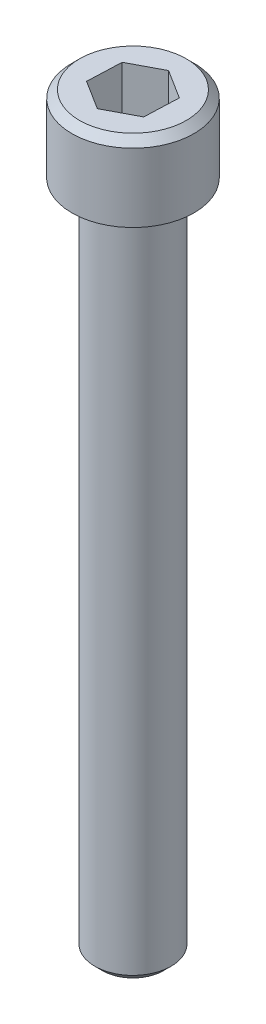
ISO-10303-21;
HEADER;
FILE_DESCRIPTION(('STEP AP214'),'2;1');
FILE_NAME('part.step','',(''),(''),'','','');
FILE_SCHEMA(('AUTOMOTIVE_DESIGN { 1 0 10303 214 1 1 1 1 }'));
ENDSEC;
DATA;
#1=APPLICATION_CONTEXT('core data for automotive mechanical design processes');
#2=APPLICATION_PROTOCOL_DEFINITION('international standard','automotive_design',2000,#1);
#3=PRODUCT_CONTEXT('',#1,'mechanical');
#4=PRODUCT('Part','Part','',(#3));
#5=PRODUCT_RELATED_PRODUCT_CATEGORY('part','',(#4));
#6=PRODUCT_DEFINITION_FORMATION('','',#4);
#7=PRODUCT_DEFINITION_CONTEXT('part definition',#1,'design');
#8=PRODUCT_DEFINITION('design','',#6,#7);
#9=PRODUCT_DEFINITION_SHAPE('','',#8);
#10=(LENGTH_UNIT() NAMED_UNIT(*) SI_UNIT(.MILLI.,.METRE.));
#11=(NAMED_UNIT(*) PLANE_ANGLE_UNIT() SI_UNIT($,.RADIAN.));
#12=(NAMED_UNIT(*) SI_UNIT($,.STERADIAN.) SOLID_ANGLE_UNIT());
#13=UNCERTAINTY_MEASURE_WITH_UNIT(LENGTH_MEASURE(1.E-05),#10,'distance_accuracy_value','');
#14=(GEOMETRIC_REPRESENTATION_CONTEXT(3) GLOBAL_UNCERTAINTY_ASSIGNED_CONTEXT((#13)) GLOBAL_UNIT_ASSIGNED_CONTEXT((#10,
#11,#12)) REPRESENTATION_CONTEXT('',''));
#15=CARTESIAN_POINT('',(0.,0.,0.));
#16=DIRECTION('',(0.,0.,1.));
#17=DIRECTION('',(1.,0.,0.));
#18=AXIS2_PLACEMENT_3D('',#15,#16,#17);
#19=CARTESIAN_POINT('',(0.,98.,0.));
#20=DIRECTION('',(0.,-1.,0.));
#21=DIRECTION('',(0.,0.,-1.));
#22=AXIS2_PLACEMENT_3D('',#19,#20,#21);
#23=CYLINDRICAL_SURFACE('',#22,8.);
#24=CARTESIAN_POINT('',(0.,88.,0.));
#25=DIRECTION('',(0.,1.,0.));
#26=DIRECTION('',(0.,0.,1.));
#27=AXIS2_PLACEMENT_3D('',#24,#25,#26);
#28=CIRCLE('',#27,8.);
#29=CARTESIAN_POINT('',(0.,88.,8.));
#30=VERTEX_POINT('',#29);
#31=EDGE_CURVE('E44',#30,#30,#28,.T.);
#32=ORIENTED_EDGE('',*,*,#31,.T.);
#33=EDGE_LOOP('',(#32));
#34=FACE_BOUND('',#33,.T.);
#35=CARTESIAN_POINT('',(0.,97.,0.));
#36=DIRECTION('',(0.,1.,0.));
#37=DIRECTION('',(0.,0.,1.));
#38=AXIS2_PLACEMENT_3D('',#35,#36,#37);
#39=CIRCLE('',#38,8.);
#40=CARTESIAN_POINT('',(0.,97.,8.));
#41=VERTEX_POINT('',#40);
#42=EDGE_CURVE('E152',#41,#41,#39,.T.);
#43=ORIENTED_EDGE('',*,*,#42,.F.);
#44=EDGE_LOOP('',(#43));
#45=FACE_BOUND('',#44,.T.);
#46=ADVANCED_FACE('F36',(#34,#45),#23,.T.);
#47=CARTESIAN_POINT('',(0.,88.,0.));
#48=DIRECTION('',(0.,-1.,0.));
#49=DIRECTION('',(0.,0.,-1.));
#50=AXIS2_PLACEMENT_3D('',#47,#48,#49);
#51=CYLINDRICAL_SURFACE('',#50,5.);
#52=CARTESIAN_POINT('',(0.,1.,0.));
#53=DIRECTION('',(0.,-1.,0.));
#54=DIRECTION('',(0.,0.,-1.));
#55=AXIS2_PLACEMENT_3D('',#52,#53,#54);
#56=CIRCLE('',#55,5.);
#57=CARTESIAN_POINT('',(0.,1.,-5.));
#58=VERTEX_POINT('',#57);
#59=EDGE_CURVE('E138',#58,#58,#56,.T.);
#60=ORIENTED_EDGE('',*,*,#59,.F.);
#61=EDGE_LOOP('',(#60));
#62=FACE_BOUND('',#61,.T.);
#63=CARTESIAN_POINT('',(0.,88.,0.));
#64=DIRECTION('',(0.,1.,0.));
#65=DIRECTION('',(0.,0.,1.));
#66=AXIS2_PLACEMENT_3D('',#63,#64,#65);
#67=CIRCLE('',#66,5.);
#68=CARTESIAN_POINT('',(0.,88.,5.));
#69=VERTEX_POINT('',#68);
#70=EDGE_CURVE('E11',#69,#69,#67,.T.);
#71=ORIENTED_EDGE('',*,*,#70,.F.);
#72=EDGE_LOOP('',(#71));
#73=FACE_BOUND('',#72,.T.);
#74=ADVANCED_FACE('F38',(#62,#73),#51,.T.);
#75=CARTESIAN_POINT('',(0.,88.,0.));
#76=DIRECTION('',(0.,1.,0.));
#77=DIRECTION('',(0.,0.,1.));
#78=AXIS2_PLACEMENT_3D('',#75,#76,#77);
#79=PLANE('',#78);
#80=ORIENTED_EDGE('',*,*,#31,.F.);
#81=EDGE_LOOP('',(#80));
#82=FACE_BOUND('',#81,.T.);
#83=ORIENTED_EDGE('',*,*,#70,.T.);
#84=EDGE_LOOP('',(#83));
#85=FACE_BOUND('',#84,.T.);
#86=ADVANCED_FACE('F159',(#82,#85),#79,.F.);
#87=CARTESIAN_POINT('',(0.,98.,0.));
#88=DIRECTION('',(0.,-1.,0.));
#89=DIRECTION('',(0.,0.,-1.));
#90=AXIS2_PLACEMENT_3D('',#87,#88,#89);
#91=CONICAL_SURFACE('',#90,7.,0.785398163397448);
#92=ORIENTED_EDGE('',*,*,#42,.T.);
#93=EDGE_LOOP('',(#92));
#94=FACE_BOUND('',#93,.T.);
#95=CARTESIAN_POINT('',(0.,98.,0.));
#96=DIRECTION('',(0.,1.,0.));
#97=DIRECTION('',(0.,0.,1.));
#98=AXIS2_PLACEMENT_3D('',#95,#96,#97);
#99=CIRCLE('',#98,7.);
#100=CARTESIAN_POINT('',(0.,98.,7.));
#101=VERTEX_POINT('',#100);
#102=EDGE_CURVE('E149',#101,#101,#99,.T.);
#103=ORIENTED_EDGE('',*,*,#102,.F.);
#104=EDGE_LOOP('',(#103));
#105=FACE_BOUND('',#104,.T.);
#106=ADVANCED_FACE('F162',(#94,#105),#91,.T.);
#107=CARTESIAN_POINT('',(0.,98.,0.));
#108=DIRECTION('',(0.,1.,0.));
#109=DIRECTION('',(0.,0.,1.));
#110=AXIS2_PLACEMENT_3D('',#107,#108,#109);
#111=PLANE('',#110);
#112=DIRECTION('',(0.884543180299683,0.,-0.46645831773624));
#113=VECTOR('',#112,1.);
#114=CARTESIAN_POINT('',(-10.3420252560608,98.,9.85959556774046));
#115=LINE('',#114,#113);
#116=CARTESIAN_POINT('',(-0.172380767326667,98.,4.49669710688366));
#117=VERTEX_POINT('',#116);
#118=CARTESIAN_POINT('',(3.8080635440219,98.,2.39763467707058));
#119=VERTEX_POINT('',#118);
#120=EDGE_CURVE('E51',#117,#119,#115,.T.);
#121=ORIENTED_EDGE('',*,*,#120,.F.);
#122=DIRECTION('',(0.846236343115979,0.,0.532807706015684));
#123=VECTOR('',#122,1.);
#124=CARTESIAN_POINT('',(-13.2058722335037,98.,-3.70945563751227));
#125=LINE('',#124,#123);
#126=CARTESIAN_POINT('',(-3.98044431134857,98.,2.09906242981308));
#127=VERTEX_POINT('',#126);
#128=EDGE_CURVE('E134',#127,#117,#125,.T.);
#129=ORIENTED_EDGE('',*,*,#128,.F.);
#130=DIRECTION('',(-0.0383068371837044,0.,0.999266023751924));
#131=VECTOR('',#130,1.);
#132=CARTESIAN_POINT('',(-3.91705962346675,98.,0.445619606468552));
#133=LINE('',#132,#131);
#134=CARTESIAN_POINT('',(-3.8080635440219,98.,-2.39763467707058));
#135=VERTEX_POINT('',#134);
#136=EDGE_CURVE('E132',#135,#127,#133,.T.);
#137=ORIENTED_EDGE('',*,*,#136,.F.);
#138=DIRECTION('',(-0.884543180299683,0.,0.46645831773624));
#139=VECTOR('',#138,1.);
#140=CARTESIAN_POINT('',(-13.977708032756,98.,2.96526378378622));
#141=LINE('',#140,#139);
#142=CARTESIAN_POINT('',(0.172380767326669,98.,-4.49669710688366));
#143=VERTEX_POINT('',#142);
#144=EDGE_CURVE('E99',#143,#135,#141,.T.);
#145=ORIENTED_EDGE('',*,*,#144,.F.);
#146=DIRECTION('',(-0.846236343115979,0.,-0.532807706015684));
#147=VECTOR('',#146,1.);
#148=CARTESIAN_POINT('',(-9.05304715482842,98.,-10.305215174209));
#149=LINE('',#148,#147);
#150=CARTESIAN_POINT('',(3.98044431134857,98.,-2.09906242981308));
#151=VERTEX_POINT('',#150);
#152=EDGE_CURVE('E128',#151,#143,#149,.T.);
#153=ORIENTED_EDGE('',*,*,#152,.F.);
#154=DIRECTION('',(0.038306837183704,0.,-0.999266023751924));
#155=VECTOR('',#154,1.);
#156=CARTESIAN_POINT('',(3.87144823190372,98.,0.744191853726046));
#157=LINE('',#156,#155);
#158=EDGE_CURVE('E125',#119,#151,#157,.T.);
#159=ORIENTED_EDGE('',*,*,#158,.F.);
#160=EDGE_LOOP('',(#121,#129,#137,#145,#153,#159));
#161=FACE_BOUND('',#160,.T.);
#162=ORIENTED_EDGE('',*,*,#102,.T.);
#163=EDGE_LOOP('',(#162));
#164=FACE_BOUND('',#163,.T.);
#165=ADVANCED_FACE('F177',(#161,#164),#111,.T.);
#166=CARTESIAN_POINT('',(0.,1.,0.));
#167=DIRECTION('',(0.,1.,0.));
#168=DIRECTION('',(0.,0.,1.));
#169=AXIS2_PLACEMENT_3D('',#166,#167,#168);
#170=CONICAL_SURFACE('',#169,5.,0.785398163397448);
#171=CARTESIAN_POINT('',(0.,0.,0.));
#172=DIRECTION('',(0.,-1.,0.));
#173=DIRECTION('',(0.,0.,-1.));
#174=AXIS2_PLACEMENT_3D('',#171,#172,#173);
#175=CIRCLE('',#174,4.);
#176=CARTESIAN_POINT('',(0.,0.,-4.));
#177=VERTEX_POINT('',#176);
#178=EDGE_CURVE('E146',#177,#177,#175,.T.);
#179=ORIENTED_EDGE('',*,*,#178,.F.);
#180=EDGE_LOOP('',(#179));
#181=FACE_BOUND('',#180,.T.);
#182=ORIENTED_EDGE('',*,*,#59,.T.);
#183=EDGE_LOOP('',(#182));
#184=FACE_BOUND('',#183,.T.);
#185=ADVANCED_FACE('F174',(#181,#184),#170,.T.);
#186=CARTESIAN_POINT('',(0.,0.,0.));
#187=DIRECTION('',(0.,1.,0.));
#188=DIRECTION('',(0.,0.,1.));
#189=AXIS2_PLACEMENT_3D('',#186,#187,#188);
#190=PLANE('',#189);
#191=ORIENTED_EDGE('',*,*,#178,.T.);
#192=EDGE_LOOP('',(#191));
#193=FACE_BOUND('',#192,.T.);
#194=ADVANCED_FACE('F176',(#193),#190,.F.);
#195=CARTESIAN_POINT('',(-10.3420252560608,91.,9.85959556774046));
#196=DIRECTION('',(0.46645831773624,0.,0.884543180299683));
#197=DIRECTION('',(0.884543180299683,0.,-0.46645831773624));
#198=AXIS2_PLACEMENT_3D('',#195,#196,#197);
#199=PLANE('',#198);
#200=ORIENTED_EDGE('',*,*,#120,.T.);
#201=DIRECTION('',(0.,1.,0.));
#202=VECTOR('',#201,1.);
#203=CARTESIAN_POINT('',(3.8080635440219,91.,2.39763467707058));
#204=LINE('',#203,#202);
#205=CARTESIAN_POINT('',(3.8080635440219,91.,2.39763467707058));
#206=VERTEX_POINT('',#205);
#207=EDGE_CURVE('E81',#206,#119,#204,.T.);
#208=ORIENTED_EDGE('',*,*,#207,.F.);
#209=DIRECTION('',(0.884543180299683,0.,-0.46645831773624));
#210=VECTOR('',#209,1.);
#211=CARTESIAN_POINT('',(-10.3420252560608,91.,9.85959556774046));
#212=LINE('',#211,#210);
#213=CARTESIAN_POINT('',(-0.172380767326667,91.,4.49669710688366));
#214=VERTEX_POINT('',#213);
#215=EDGE_CURVE('E136',#214,#206,#212,.T.);
#216=ORIENTED_EDGE('',*,*,#215,.F.);
#217=DIRECTION('',(0.,1.,0.));
#218=VECTOR('',#217,1.);
#219=CARTESIAN_POINT('',(-0.172380767326667,91.,4.49669710688366));
#220=LINE('',#219,#218);
#221=EDGE_CURVE('E59',#214,#117,#220,.T.);
#222=ORIENTED_EDGE('',*,*,#221,.T.);
#223=EDGE_LOOP('',(#200,#208,#216,#222));
#224=FACE_BOUND('',#223,.T.);
#225=ADVANCED_FACE('F184',(#224),#199,.F.);
#226=CARTESIAN_POINT('',(-13.2058722335037,91.,-3.70945563751227));
#227=DIRECTION('',(-0.532807706015684,0.,0.846236343115979));
#228=DIRECTION('',(0.846236343115979,0.,0.532807706015684));
#229=AXIS2_PLACEMENT_3D('',#226,#227,#228);
#230=PLANE('',#229);
#231=ORIENTED_EDGE('',*,*,#128,.T.);
#232=ORIENTED_EDGE('',*,*,#221,.F.);
#233=DIRECTION('',(0.846236343115979,0.,0.532807706015684));
#234=VECTOR('',#233,1.);
#235=CARTESIAN_POINT('',(-13.2058722335037,91.,-3.70945563751227));
#236=LINE('',#235,#234);
#237=CARTESIAN_POINT('',(-3.98044431134857,91.,2.09906242981308));
#238=VERTEX_POINT('',#237);
#239=EDGE_CURVE('E111',#238,#214,#236,.T.);
#240=ORIENTED_EDGE('',*,*,#239,.F.);
#241=DIRECTION('',(0.,1.,0.));
#242=VECTOR('',#241,1.);
#243=CARTESIAN_POINT('',(-3.98044431134857,91.,2.09906242981308));
#244=LINE('',#243,#242);
#245=EDGE_CURVE('E103',#238,#127,#244,.T.);
#246=ORIENTED_EDGE('',*,*,#245,.T.);
#247=EDGE_LOOP('',(#231,#232,#240,#246));
#248=FACE_BOUND('',#247,.T.);
#249=ADVANCED_FACE('F222',(#248),#230,.F.);
#250=CARTESIAN_POINT('',(-3.91705962346675,91.,0.445619606468552));
#251=DIRECTION('',(-0.999266023751924,0.,-0.0383068371837044));
#252=DIRECTION('',(-0.0383068371837044,0.,0.999266023751924));
#253=AXIS2_PLACEMENT_3D('',#250,#251,#252);
#254=PLANE('',#253);
#255=ORIENTED_EDGE('',*,*,#136,.T.);
#256=ORIENTED_EDGE('',*,*,#245,.F.);
#257=DIRECTION('',(-0.0383068371837044,0.,0.999266023751924));
#258=VECTOR('',#257,1.);
#259=CARTESIAN_POINT('',(-3.91705962346675,91.,0.445619606468552));
#260=LINE('',#259,#258);
#261=CARTESIAN_POINT('',(-3.8080635440219,91.,-2.39763467707058));
#262=VERTEX_POINT('',#261);
#263=EDGE_CURVE('E107',#262,#238,#260,.T.);
#264=ORIENTED_EDGE('',*,*,#263,.F.);
#265=DIRECTION('',(0.,1.,0.));
#266=VECTOR('',#265,1.);
#267=CARTESIAN_POINT('',(-3.8080635440219,91.,-2.39763467707058));
#268=LINE('',#267,#266);
#269=EDGE_CURVE('E92',#262,#135,#268,.T.);
#270=ORIENTED_EDGE('',*,*,#269,.T.);
#271=EDGE_LOOP('',(#255,#256,#264,#270));
#272=FACE_BOUND('',#271,.T.);
#273=ADVANCED_FACE('F108',(#272),#254,.F.);
#274=CARTESIAN_POINT('',(-13.977708032756,91.,2.96526378378622));
#275=DIRECTION('',(-0.46645831773624,0.,-0.884543180299683));
#276=DIRECTION('',(-0.884543180299683,0.,0.46645831773624));
#277=AXIS2_PLACEMENT_3D('',#274,#275,#276);
#278=PLANE('',#277);
#279=ORIENTED_EDGE('',*,*,#144,.T.);
#280=ORIENTED_EDGE('',*,*,#269,.F.);
#281=DIRECTION('',(-0.884543180299683,0.,0.46645831773624));
#282=VECTOR('',#281,1.);
#283=CARTESIAN_POINT('',(-13.977708032756,91.,2.96526378378622));
#284=LINE('',#283,#282);
#285=CARTESIAN_POINT('',(0.172380767326669,91.,-4.49669710688366));
#286=VERTEX_POINT('',#285);
#287=EDGE_CURVE('E96',#286,#262,#284,.T.);
#288=ORIENTED_EDGE('',*,*,#287,.F.);
#289=DIRECTION('',(0.,1.,0.));
#290=VECTOR('',#289,1.);
#291=CARTESIAN_POINT('',(0.172380767326669,91.,-4.49669710688366));
#292=LINE('',#291,#290);
#293=EDGE_CURVE('E104',#286,#143,#292,.T.);
#294=ORIENTED_EDGE('',*,*,#293,.T.);
#295=EDGE_LOOP('',(#279,#280,#288,#294));
#296=FACE_BOUND('',#295,.T.);
#297=ADVANCED_FACE('F94',(#296),#278,.F.);
#298=CARTESIAN_POINT('',(-9.05304715482842,91.,-10.305215174209));
#299=DIRECTION('',(0.532807706015684,0.,-0.846236343115979));
#300=DIRECTION('',(-0.846236343115979,0.,-0.532807706015684));
#301=AXIS2_PLACEMENT_3D('',#298,#299,#300);
#302=PLANE('',#301);
#303=ORIENTED_EDGE('',*,*,#152,.T.);
#304=ORIENTED_EDGE('',*,*,#293,.F.);
#305=DIRECTION('',(-0.846236343115979,0.,-0.532807706015684));
#306=VECTOR('',#305,1.);
#307=CARTESIAN_POINT('',(-9.05304715482842,91.,-10.305215174209));
#308=LINE('',#307,#306);
#309=CARTESIAN_POINT('',(3.98044431134857,91.,-2.09906242981308));
#310=VERTEX_POINT('',#309);
#311=EDGE_CURVE('E117',#310,#286,#308,.T.);
#312=ORIENTED_EDGE('',*,*,#311,.F.);
#313=DIRECTION('',(0.,1.,0.));
#314=VECTOR('',#313,1.);
#315=CARTESIAN_POINT('',(3.98044431134857,91.,-2.09906242981308));
#316=LINE('',#315,#314);
#317=EDGE_CURVE('E141',#310,#151,#316,.T.);
#318=ORIENTED_EDGE('',*,*,#317,.T.);
#319=EDGE_LOOP('',(#303,#304,#312,#318));
#320=FACE_BOUND('',#319,.T.);
#321=ADVANCED_FACE('F247',(#320),#302,.F.);
#322=CARTESIAN_POINT('',(3.87144823190372,91.,0.744191853726046));
#323=DIRECTION('',(0.999266023751924,0.,0.038306837183704));
#324=DIRECTION('',(0.038306837183704,0.,-0.999266023751924));
#325=AXIS2_PLACEMENT_3D('',#322,#323,#324);
#326=PLANE('',#325);
#327=ORIENTED_EDGE('',*,*,#158,.T.);
#328=ORIENTED_EDGE('',*,*,#317,.F.);
#329=DIRECTION('',(0.038306837183704,0.,-0.999266023751924));
#330=VECTOR('',#329,1.);
#331=CARTESIAN_POINT('',(3.87144823190372,91.,0.744191853726046));
#332=LINE('',#331,#330);
#333=EDGE_CURVE('E119',#206,#310,#332,.T.);
#334=ORIENTED_EDGE('',*,*,#333,.F.);
#335=ORIENTED_EDGE('',*,*,#207,.T.);
#336=EDGE_LOOP('',(#327,#328,#334,#335));
#337=FACE_BOUND('',#336,.T.);
#338=ADVANCED_FACE('F256',(#337),#326,.F.);
#339=CARTESIAN_POINT('',(-15.5414213562373,91.,0.));
#340=DIRECTION('',(0.,1.,0.));
#341=DIRECTION('',(0.,0.,1.));
#342=AXIS2_PLACEMENT_3D('',#339,#340,#341);
#343=PLANE('',#342);
#344=ORIENTED_EDGE('',*,*,#215,.T.);
#345=ORIENTED_EDGE('',*,*,#333,.T.);
#346=ORIENTED_EDGE('',*,*,#311,.T.);
#347=ORIENTED_EDGE('',*,*,#287,.T.);
#348=ORIENTED_EDGE('',*,*,#263,.T.);
#349=ORIENTED_EDGE('',*,*,#239,.T.);
#350=EDGE_LOOP('',(#344,#345,#346,#347,#348,#349));
#351=FACE_BOUND('',#350,.T.);
#352=ADVANCED_FACE('F114',(#351),#343,.T.);
#353=CLOSED_SHELL('',(#46,#74,#86,#106,#165,#185,#194,#225,#249,#273,#297,#321,#338,#352));
#354=MANIFOLD_SOLID_BREP('B2',#353);
#355=ADVANCED_BREP_SHAPE_REPRESENTATION('',(#18,#354),#14);
#356=SHAPE_DEFINITION_REPRESENTATION(#9,#355);
ENDSEC;
END-ISO-10303-21;
